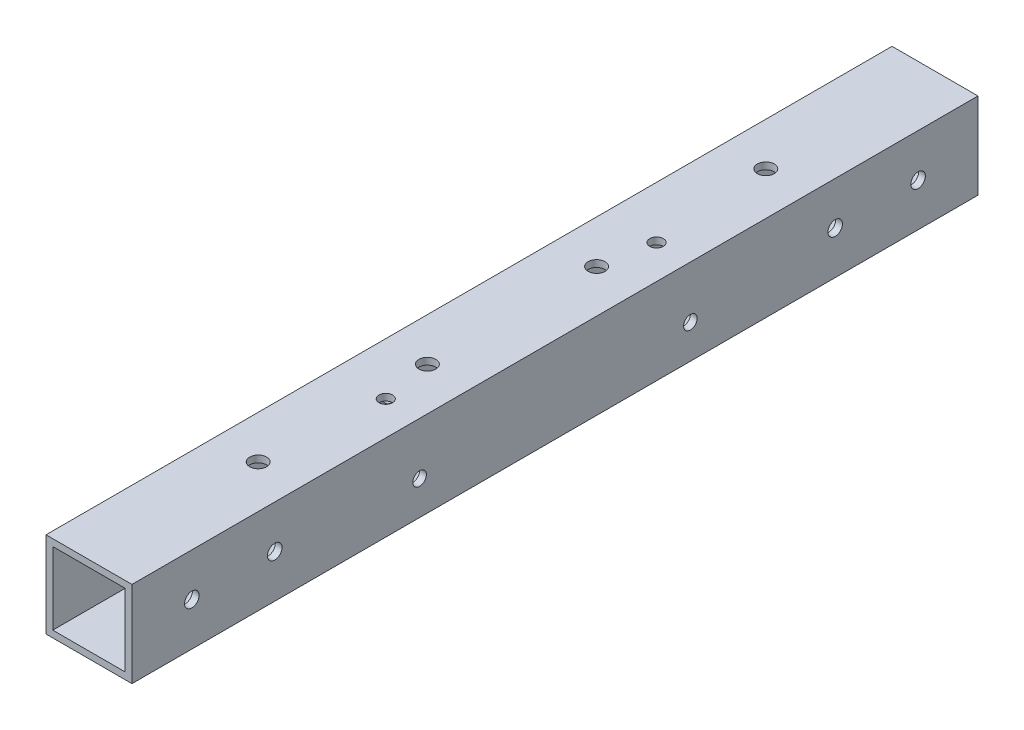
ISO-10303-21;
HEADER;
FILE_DESCRIPTION(('STEP AP214'),'2;1');
FILE_NAME('part.step','',(''),(''),'','','');
FILE_SCHEMA(('AUTOMOTIVE_DESIGN { 1 0 10303 214 1 1 1 1 }'));
ENDSEC;
DATA;
#1=APPLICATION_CONTEXT('core data for automotive mechanical design processes');
#2=APPLICATION_PROTOCOL_DEFINITION('international standard','automotive_design',2000,#1);
#3=PRODUCT_CONTEXT('',#1,'mechanical');
#4=PRODUCT('Part','Part','',(#3));
#5=PRODUCT_RELATED_PRODUCT_CATEGORY('part','',(#4));
#6=PRODUCT_DEFINITION_FORMATION('','',#4);
#7=PRODUCT_DEFINITION_CONTEXT('part definition',#1,'design');
#8=PRODUCT_DEFINITION('design','',#6,#7);
#9=PRODUCT_DEFINITION_SHAPE('','',#8);
#10=(LENGTH_UNIT() NAMED_UNIT(*) SI_UNIT(.MILLI.,.METRE.));
#11=(NAMED_UNIT(*) PLANE_ANGLE_UNIT() SI_UNIT($,.RADIAN.));
#12=(NAMED_UNIT(*) SI_UNIT($,.STERADIAN.) SOLID_ANGLE_UNIT());
#13=UNCERTAINTY_MEASURE_WITH_UNIT(LENGTH_MEASURE(1.E-05),#10,'distance_accuracy_value','');
#14=(GEOMETRIC_REPRESENTATION_CONTEXT(3) GLOBAL_UNCERTAINTY_ASSIGNED_CONTEXT((#13)) GLOBAL_UNIT_ASSIGNED_CONTEXT((#10,
#11,#12)) REPRESENTATION_CONTEXT('',''));
#15=CARTESIAN_POINT('',(0.,0.,0.));
#16=DIRECTION('',(0.,0.,1.));
#17=DIRECTION('',(1.,0.,0.));
#18=AXIS2_PLACEMENT_3D('',#15,#16,#17);
#19=CARTESIAN_POINT('',(0.,0.,250.));
#20=DIRECTION('',(0.,0.,1.));
#21=DIRECTION('',(1.,0.,0.));
#22=AXIS2_PLACEMENT_3D('',#19,#20,#21);
#23=PLANE('',#22);
#24=DIRECTION('',(0.,-1.,0.));
#25=VECTOR('',#24,1.);
#26=CARTESIAN_POINT('',(-12.7,12.7,250.));
#27=LINE('',#26,#25);
#28=CARTESIAN_POINT('',(-12.7,12.7,250.));
#29=VERTEX_POINT('',#28);
#30=CARTESIAN_POINT('',(-12.7,-12.7,250.));
#31=VERTEX_POINT('',#30);
#32=EDGE_CURVE('E137',#29,#31,#27,.T.);
#33=ORIENTED_EDGE('',*,*,#32,.T.);
#34=DIRECTION('',(1.,0.,0.));
#35=VECTOR('',#34,1.);
#36=CARTESIAN_POINT('',(-12.7,-12.7,250.));
#37=LINE('',#36,#35);
#38=CARTESIAN_POINT('',(12.7,-12.7,250.));
#39=VERTEX_POINT('',#38);
#40=EDGE_CURVE('E140',#31,#39,#37,.T.);
#41=ORIENTED_EDGE('',*,*,#40,.T.);
#42=DIRECTION('',(0.,-1.,0.));
#43=VECTOR('',#42,1.);
#44=CARTESIAN_POINT('',(12.7,12.7,250.));
#45=LINE('',#44,#43);
#46=CARTESIAN_POINT('',(12.7,12.7,250.));
#47=VERTEX_POINT('',#46);
#48=EDGE_CURVE('E143',#47,#39,#45,.T.);
#49=ORIENTED_EDGE('',*,*,#48,.F.);
#50=DIRECTION('',(1.,0.,0.));
#51=VECTOR('',#50,1.);
#52=CARTESIAN_POINT('',(-12.7,12.7,250.));
#53=LINE('',#52,#51);
#54=EDGE_CURVE('E146',#29,#47,#53,.T.);
#55=ORIENTED_EDGE('',*,*,#54,.F.);
#56=EDGE_LOOP('',(#33,#41,#49,#55));
#57=FACE_BOUND('',#56,.T.);
#58=DIRECTION('',(1.,0.,0.));
#59=VECTOR('',#58,1.);
#60=CARTESIAN_POINT('',(-10.7,-10.7,250.));
#61=LINE('',#60,#59);
#62=CARTESIAN_POINT('',(-10.7,-10.7,250.));
#63=VERTEX_POINT('',#62);
#64=CARTESIAN_POINT('',(10.7,-10.7,250.));
#65=VERTEX_POINT('',#64);
#66=EDGE_CURVE('E109',#63,#65,#61,.T.);
#67=ORIENTED_EDGE('',*,*,#66,.F.);
#68=DIRECTION('',(0.,-1.,0.));
#69=VECTOR('',#68,1.);
#70=CARTESIAN_POINT('',(-10.7,10.7,250.));
#71=LINE('',#70,#69);
#72=CARTESIAN_POINT('',(-10.7,10.7,250.));
#73=VERTEX_POINT('',#72);
#74=EDGE_CURVE('E100',#73,#63,#71,.T.);
#75=ORIENTED_EDGE('',*,*,#74,.F.);
#76=DIRECTION('',(1.,0.,0.));
#77=VECTOR('',#76,1.);
#78=CARTESIAN_POINT('',(-10.7,10.7,250.));
#79=LINE('',#78,#77);
#80=CARTESIAN_POINT('',(10.7,10.7,250.));
#81=VERTEX_POINT('',#80);
#82=EDGE_CURVE('E120',#73,#81,#79,.T.);
#83=ORIENTED_EDGE('',*,*,#82,.T.);
#84=DIRECTION('',(0.,-1.,0.));
#85=VECTOR('',#84,1.);
#86=CARTESIAN_POINT('',(10.7,10.7,250.));
#87=LINE('',#86,#85);
#88=EDGE_CURVE('E50',#81,#65,#87,.T.);
#89=ORIENTED_EDGE('',*,*,#88,.T.);
#90=EDGE_LOOP('',(#67,#75,#83,#89));
#91=FACE_BOUND('',#90,.T.);
#92=ADVANCED_FACE('F33',(#57,#91),#23,.T.);
#93=CARTESIAN_POINT('',(0.,0.,0.));
#94=DIRECTION('',(0.,0.,1.));
#95=DIRECTION('',(1.,0.,0.));
#96=AXIS2_PLACEMENT_3D('',#93,#94,#95);
#97=PLANE('',#96);
#98=DIRECTION('',(0.,-1.,0.));
#99=VECTOR('',#98,1.);
#100=CARTESIAN_POINT('',(-12.7,12.7,0.));
#101=LINE('',#100,#99);
#102=CARTESIAN_POINT('',(-12.7,12.7,0.));
#103=VERTEX_POINT('',#102);
#104=CARTESIAN_POINT('',(-12.7,-12.7,0.));
#105=VERTEX_POINT('',#104);
#106=EDGE_CURVE('E116',#103,#105,#101,.T.);
#107=ORIENTED_EDGE('',*,*,#106,.F.);
#108=DIRECTION('',(1.,0.,0.));
#109=VECTOR('',#108,1.);
#110=CARTESIAN_POINT('',(-12.7,12.7,0.));
#111=LINE('',#110,#109);
#112=CARTESIAN_POINT('',(12.7,12.7,0.));
#113=VERTEX_POINT('',#112);
#114=EDGE_CURVE('E141',#103,#113,#111,.T.);
#115=ORIENTED_EDGE('',*,*,#114,.T.);
#116=DIRECTION('',(0.,-1.,0.));
#117=VECTOR('',#116,1.);
#118=CARTESIAN_POINT('',(12.7,12.7,0.));
#119=LINE('',#118,#117);
#120=CARTESIAN_POINT('',(12.7,-12.7,0.));
#121=VERTEX_POINT('',#120);
#122=EDGE_CURVE('E155',#113,#121,#119,.T.);
#123=ORIENTED_EDGE('',*,*,#122,.T.);
#124=DIRECTION('',(1.,0.,0.));
#125=VECTOR('',#124,1.);
#126=CARTESIAN_POINT('',(-12.7,-12.7,0.));
#127=LINE('',#126,#125);
#128=EDGE_CURVE('E152',#105,#121,#127,.T.);
#129=ORIENTED_EDGE('',*,*,#128,.F.);
#130=EDGE_LOOP('',(#107,#115,#123,#129));
#131=FACE_BOUND('',#130,.T.);
#132=DIRECTION('',(0.,-1.,0.));
#133=VECTOR('',#132,1.);
#134=CARTESIAN_POINT('',(-10.7,10.7,0.));
#135=LINE('',#134,#133);
#136=CARTESIAN_POINT('',(-10.7,10.7,0.));
#137=VERTEX_POINT('',#136);
#138=CARTESIAN_POINT('',(-10.7,-10.7,0.));
#139=VERTEX_POINT('',#138);
#140=EDGE_CURVE('E58',#137,#139,#135,.T.);
#141=ORIENTED_EDGE('',*,*,#140,.T.);
#142=DIRECTION('',(1.,0.,0.));
#143=VECTOR('',#142,1.);
#144=CARTESIAN_POINT('',(-10.7,-10.7,0.));
#145=LINE('',#144,#143);
#146=CARTESIAN_POINT('',(10.7,-10.7,0.));
#147=VERTEX_POINT('',#146);
#148=EDGE_CURVE('E115',#139,#147,#145,.T.);
#149=ORIENTED_EDGE('',*,*,#148,.T.);
#150=DIRECTION('',(0.,-1.,0.));
#151=VECTOR('',#150,1.);
#152=CARTESIAN_POINT('',(10.7,10.7,0.));
#153=LINE('',#152,#151);
#154=CARTESIAN_POINT('',(10.7,10.7,0.));
#155=VERTEX_POINT('',#154);
#156=EDGE_CURVE('E128',#155,#147,#153,.T.);
#157=ORIENTED_EDGE('',*,*,#156,.F.);
#158=DIRECTION('',(1.,0.,0.));
#159=VECTOR('',#158,1.);
#160=CARTESIAN_POINT('',(-10.7,10.7,0.));
#161=LINE('',#160,#159);
#162=EDGE_CURVE('E110',#137,#155,#161,.T.);
#163=ORIENTED_EDGE('',*,*,#162,.F.);
#164=EDGE_LOOP('',(#141,#149,#157,#163));
#165=FACE_BOUND('',#164,.T.);
#166=ADVANCED_FACE('F323',(#131,#165),#97,.F.);
#167=CARTESIAN_POINT('',(-12.7,12.7,250.));
#168=DIRECTION('',(1.,0.,0.));
#169=DIRECTION('',(0.,1.,0.));
#170=AXIS2_PLACEMENT_3D('',#167,#168,#169);
#171=PLANE('',#170);
#172=CARTESIAN_POINT('',(-12.7,-2.69999999999985,84.9999999999999));
#173=DIRECTION('',(1.,0.,0.));
#174=DIRECTION('',(0.,1.,0.));
#175=AXIS2_PLACEMENT_3D('',#172,#173,#174);
#176=CIRCLE('',#175,2.);
#177=CARTESIAN_POINT('',(-12.7,-0.699999999999858,84.9999999999999));
#178=VERTEX_POINT('',#177);
#179=EDGE_CURVE('E233',#178,#178,#176,.T.);
#180=ORIENTED_EDGE('',*,*,#179,.T.);
#181=EDGE_LOOP('',(#180));
#182=FACE_BOUND('',#181,.T.);
#183=CARTESIAN_POINT('',(-12.7,-2.69999999999985,165.));
#184=DIRECTION('',(1.,0.,0.));
#185=DIRECTION('',(0.,1.,0.));
#186=AXIS2_PLACEMENT_3D('',#183,#184,#185);
#187=CIRCLE('',#186,2.00000000000002);
#188=CARTESIAN_POINT('',(-12.7,-0.69999999999983,165.));
#189=VERTEX_POINT('',#188);
#190=EDGE_CURVE('E244',#189,#189,#187,.T.);
#191=ORIENTED_EDGE('',*,*,#190,.T.);
#192=EDGE_LOOP('',(#191));
#193=FACE_BOUND('',#192,.T.);
#194=CARTESIAN_POINT('',(-12.7,0.,50.));
#195=DIRECTION('',(-1.,0.,0.));
#196=DIRECTION('',(0.,-1.,0.));
#197=AXIS2_PLACEMENT_3D('',#194,#195,#196);
#198=CIRCLE('',#197,2.5);
#199=CARTESIAN_POINT('',(-12.7,-2.5,50.));
#200=VERTEX_POINT('',#199);
#201=EDGE_CURVE('E221',#200,#200,#198,.T.);
#202=ORIENTED_EDGE('',*,*,#201,.F.);
#203=EDGE_LOOP('',(#202));
#204=FACE_BOUND('',#203,.T.);
#205=CARTESIAN_POINT('',(-12.7,0.,200.));
#206=DIRECTION('',(-1.,0.,0.));
#207=DIRECTION('',(0.,-1.,0.));
#208=AXIS2_PLACEMENT_3D('',#205,#206,#207);
#209=CIRCLE('',#208,2.5);
#210=CARTESIAN_POINT('',(-12.7,-2.5,200.));
#211=VERTEX_POINT('',#210);
#212=EDGE_CURVE('E284',#211,#211,#209,.T.);
#213=ORIENTED_EDGE('',*,*,#212,.F.);
#214=EDGE_LOOP('',(#213));
#215=FACE_BOUND('',#214,.T.);
#216=CARTESIAN_POINT('',(-12.7,0.,150.));
#217=DIRECTION('',(-1.,0.,0.));
#218=DIRECTION('',(0.,-1.,0.));
#219=AXIS2_PLACEMENT_3D('',#216,#217,#218);
#220=CIRCLE('',#219,2.5);
#221=CARTESIAN_POINT('',(-12.7,-2.5,150.));
#222=VERTEX_POINT('',#221);
#223=EDGE_CURVE('E281',#222,#222,#220,.T.);
#224=ORIENTED_EDGE('',*,*,#223,.F.);
#225=EDGE_LOOP('',(#224));
#226=FACE_BOUND('',#225,.T.);
#227=CARTESIAN_POINT('',(-12.7,0.,100.));
#228=DIRECTION('',(-1.,0.,0.));
#229=DIRECTION('',(0.,-1.,0.));
#230=AXIS2_PLACEMENT_3D('',#227,#228,#229);
#231=CIRCLE('',#230,2.5);
#232=CARTESIAN_POINT('',(-12.7,-2.5,100.));
#233=VERTEX_POINT('',#232);
#234=EDGE_CURVE('E198',#233,#233,#231,.T.);
#235=ORIENTED_EDGE('',*,*,#234,.F.);
#236=EDGE_LOOP('',(#235));
#237=FACE_BOUND('',#236,.T.);
#238=ORIENTED_EDGE('',*,*,#106,.T.);
#239=DIRECTION('',(0.,0.,-1.));
#240=VECTOR('',#239,1.);
#241=CARTESIAN_POINT('',(-12.7,-12.7,250.));
#242=LINE('',#241,#240);
#243=EDGE_CURVE('E11',#31,#105,#242,.T.);
#244=ORIENTED_EDGE('',*,*,#243,.F.);
#245=ORIENTED_EDGE('',*,*,#32,.F.);
#246=DIRECTION('',(0.,0.,-1.));
#247=VECTOR('',#246,1.);
#248=CARTESIAN_POINT('',(-12.7,12.7,250.));
#249=LINE('',#248,#247);
#250=EDGE_CURVE('E149',#29,#103,#249,.T.);
#251=ORIENTED_EDGE('',*,*,#250,.T.);
#252=EDGE_LOOP('',(#238,#244,#245,#251));
#253=FACE_BOUND('',#252,.T.);
#254=ADVANCED_FACE('F35',(#182,#193,#204,#215,#226,#237,#253),#171,.F.);
#255=CARTESIAN_POINT('',(-12.7,-12.7,250.));
#256=DIRECTION('',(0.,1.,0.));
#257=DIRECTION('',(0.,0.,1.));
#258=AXIS2_PLACEMENT_3D('',#255,#256,#257);
#259=PLANE('',#258);
#260=CARTESIAN_POINT('',(2.70000000000002,-12.7,165.));
#261=DIRECTION('',(0.,-1.,0.));
#262=DIRECTION('',(0.,0.,-1.));
#263=AXIS2_PLACEMENT_3D('',#260,#261,#262);
#264=CIRCLE('',#263,2.);
#265=CARTESIAN_POINT('',(2.70000000000002,-12.7,163.));
#266=VERTEX_POINT('',#265);
#267=EDGE_CURVE('E258',#266,#266,#264,.T.);
#268=ORIENTED_EDGE('',*,*,#267,.F.);
#269=EDGE_LOOP('',(#268));
#270=FACE_BOUND('',#269,.T.);
#271=CARTESIAN_POINT('',(2.70000000000002,-12.7,85.0000000000001));
#272=DIRECTION('',(0.,-1.,0.));
#273=DIRECTION('',(0.,0.,-1.));
#274=AXIS2_PLACEMENT_3D('',#271,#272,#273);
#275=CIRCLE('',#274,2.00000000000001);
#276=CARTESIAN_POINT('',(2.70000000000002,-12.7,83.0000000000001));
#277=VERTEX_POINT('',#276);
#278=EDGE_CURVE('E255',#277,#277,#275,.T.);
#279=ORIENTED_EDGE('',*,*,#278,.F.);
#280=EDGE_LOOP('',(#279));
#281=FACE_BOUND('',#280,.T.);
#282=CARTESIAN_POINT('',(0.,-12.7,42.1999999862548));
#283=DIRECTION('',(0.,-1.,0.));
#284=DIRECTION('',(0.,0.,-1.));
#285=AXIS2_PLACEMENT_3D('',#282,#283,#284);
#286=CIRCLE('',#285,2.1500000040323);
#287=CARTESIAN_POINT('',(0.,-12.7,40.0499999822225));
#288=VERTEX_POINT('',#287);
#289=EDGE_CURVE('E190',#288,#288,#286,.T.);
#290=ORIENTED_EDGE('',*,*,#289,.F.);
#291=EDGE_LOOP('',(#290));
#292=FACE_BOUND('',#291,.T.);
#293=CARTESIAN_POINT('',(0.,-12.7,17.6999999862548));
#294=DIRECTION('',(0.,-1.,0.));
#295=DIRECTION('',(0.,0.,-1.));
#296=AXIS2_PLACEMENT_3D('',#293,#294,#295);
#297=CIRCLE('',#296,2.1500000040323);
#298=CARTESIAN_POINT('',(0.,-12.7,15.5499999822225));
#299=VERTEX_POINT('',#298);
#300=EDGE_CURVE('E207',#299,#299,#297,.T.);
#301=ORIENTED_EDGE('',*,*,#300,.F.);
#302=EDGE_LOOP('',(#301));
#303=FACE_BOUND('',#302,.T.);
#304=CARTESIAN_POINT('',(0.,-12.7,232.3));
#305=DIRECTION('',(0.,-1.,0.));
#306=DIRECTION('',(0.,0.,-1.));
#307=AXIS2_PLACEMENT_3D('',#304,#305,#306);
#308=CIRCLE('',#307,2.14999999994746);
#309=CARTESIAN_POINT('',(0.,-12.7,230.150000000053));
#310=VERTEX_POINT('',#309);
#311=EDGE_CURVE('E174',#310,#310,#308,.T.);
#312=ORIENTED_EDGE('',*,*,#311,.F.);
#313=EDGE_LOOP('',(#312));
#314=FACE_BOUND('',#313,.T.);
#315=CARTESIAN_POINT('',(0.,-12.7,207.8));
#316=DIRECTION('',(0.,-1.,0.));
#317=DIRECTION('',(0.,0.,-1.));
#318=AXIS2_PLACEMENT_3D('',#315,#316,#317);
#319=CIRCLE('',#318,2.14999999994746);
#320=CARTESIAN_POINT('',(0.,-12.7,205.650000000052));
#321=VERTEX_POINT('',#320);
#322=EDGE_CURVE('E185',#321,#321,#319,.T.);
#323=ORIENTED_EDGE('',*,*,#322,.F.);
#324=EDGE_LOOP('',(#323));
#325=FACE_BOUND('',#324,.T.);
#326=ORIENTED_EDGE('',*,*,#128,.T.);
#327=DIRECTION('',(0.,0.,-1.));
#328=VECTOR('',#327,1.);
#329=CARTESIAN_POINT('',(12.7,-12.7,250.));
#330=LINE('',#329,#328);
#331=EDGE_CURVE('E42',#39,#121,#330,.T.);
#332=ORIENTED_EDGE('',*,*,#331,.F.);
#333=ORIENTED_EDGE('',*,*,#40,.F.);
#334=ORIENTED_EDGE('',*,*,#243,.T.);
#335=EDGE_LOOP('',(#326,#332,#333,#334));
#336=FACE_BOUND('',#335,.T.);
#337=ADVANCED_FACE('F314',(#270,#281,#292,#303,#314,#325,#336),#259,.F.);
#338=CARTESIAN_POINT('',(12.7,12.7,250.));
#339=DIRECTION('',(1.,0.,0.));
#340=DIRECTION('',(0.,1.,0.));
#341=AXIS2_PLACEMENT_3D('',#338,#339,#340);
#342=PLANE('',#341);
#343=CARTESIAN_POINT('',(12.7,-2.69999999999985,84.9999999999999));
#344=DIRECTION('',(1.,0.,0.));
#345=DIRECTION('',(0.,1.,0.));
#346=AXIS2_PLACEMENT_3D('',#343,#344,#345);
#347=CIRCLE('',#346,2.);
#348=CARTESIAN_POINT('',(12.7,-0.699999999999854,84.9999999999999));
#349=VERTEX_POINT('',#348);
#350=EDGE_CURVE('E239',#349,#349,#347,.T.);
#351=ORIENTED_EDGE('',*,*,#350,.F.);
#352=EDGE_LOOP('',(#351));
#353=FACE_BOUND('',#352,.T.);
#354=CARTESIAN_POINT('',(12.7,-2.69999999999985,165.));
#355=DIRECTION('',(1.,0.,0.));
#356=DIRECTION('',(0.,1.,0.));
#357=AXIS2_PLACEMENT_3D('',#354,#355,#356);
#358=CIRCLE('',#357,2.00000000000002);
#359=CARTESIAN_POINT('',(12.7,-0.699999999999827,165.));
#360=VERTEX_POINT('',#359);
#361=EDGE_CURVE('E249',#360,#360,#358,.T.);
#362=ORIENTED_EDGE('',*,*,#361,.F.);
#363=EDGE_LOOP('',(#362));
#364=FACE_BOUND('',#363,.T.);
#365=CARTESIAN_POINT('',(12.7,-9.80214607398944E-09,42.1999999853121));
#366=DIRECTION('',(1.,0.,0.));
#367=DIRECTION('',(0.,1.,0.));
#368=AXIS2_PLACEMENT_3D('',#365,#366,#367);
#369=CIRCLE('',#368,2.15);
#370=CARTESIAN_POINT('',(12.7,2.14999999019786,42.1999999853121));
#371=VERTEX_POINT('',#370);
#372=EDGE_CURVE('E182',#371,#371,#369,.T.);
#373=ORIENTED_EDGE('',*,*,#372,.F.);
#374=EDGE_LOOP('',(#373));
#375=FACE_BOUND('',#374,.T.);
#376=CARTESIAN_POINT('',(12.7,-9.82510210342791E-09,17.6999999853121));
#377=DIRECTION('',(1.,0.,0.));
#378=DIRECTION('',(0.,1.,0.));
#379=AXIS2_PLACEMENT_3D('',#376,#377,#378);
#380=CIRCLE('',#379,2.14999999956341);
#381=CARTESIAN_POINT('',(12.7,2.14999998973831,17.6999999853121));
#382=VERTEX_POINT('',#381);
#383=EDGE_CURVE('E193',#382,#382,#380,.T.);
#384=ORIENTED_EDGE('',*,*,#383,.F.);
#385=EDGE_LOOP('',(#384));
#386=FACE_BOUND('',#385,.T.);
#387=CARTESIAN_POINT('',(12.7,0.,232.3));
#388=DIRECTION('',(1.,0.,0.));
#389=DIRECTION('',(0.,1.,0.));
#390=AXIS2_PLACEMENT_3D('',#387,#388,#389);
#391=CIRCLE('',#390,2.15000000000002);
#392=CARTESIAN_POINT('',(12.7,2.15000000000001,232.3));
#393=VERTEX_POINT('',#392);
#394=EDGE_CURVE('E167',#393,#393,#391,.T.);
#395=ORIENTED_EDGE('',*,*,#394,.F.);
#396=EDGE_LOOP('',(#395));
#397=FACE_BOUND('',#396,.T.);
#398=CARTESIAN_POINT('',(12.7,0.,207.8));
#399=DIRECTION('',(1.,0.,0.));
#400=DIRECTION('',(0.,1.,0.));
#401=AXIS2_PLACEMENT_3D('',#398,#399,#400);
#402=CIRCLE('',#401,2.14999999999996);
#403=CARTESIAN_POINT('',(12.7,2.14999999999996,207.8));
#404=VERTEX_POINT('',#403);
#405=EDGE_CURVE('E177',#404,#404,#402,.T.);
#406=ORIENTED_EDGE('',*,*,#405,.F.);
#407=EDGE_LOOP('',(#406));
#408=FACE_BOUND('',#407,.T.);
#409=ORIENTED_EDGE('',*,*,#122,.F.);
#410=DIRECTION('',(0.,0.,-1.));
#411=VECTOR('',#410,1.);
#412=CARTESIAN_POINT('',(12.7,12.7,250.));
#413=LINE('',#412,#411);
#414=EDGE_CURVE('E161',#47,#113,#413,.T.);
#415=ORIENTED_EDGE('',*,*,#414,.F.);
#416=ORIENTED_EDGE('',*,*,#48,.T.);
#417=ORIENTED_EDGE('',*,*,#331,.T.);
#418=EDGE_LOOP('',(#409,#415,#416,#417));
#419=FACE_BOUND('',#418,.T.);
#420=ADVANCED_FACE('F310',(#353,#364,#375,#386,#397,#408,#419),#342,.T.);
#421=CARTESIAN_POINT('',(-12.7,12.7,250.));
#422=DIRECTION('',(0.,1.,0.));
#423=DIRECTION('',(0.,0.,1.));
#424=AXIS2_PLACEMENT_3D('',#421,#422,#423);
#425=PLANE('',#424);
#426=CARTESIAN_POINT('',(2.70000000000002,12.7,165.));
#427=DIRECTION('',(0.,-1.,0.));
#428=DIRECTION('',(0.,0.,-1.));
#429=AXIS2_PLACEMENT_3D('',#426,#427,#428);
#430=CIRCLE('',#429,2.);
#431=CARTESIAN_POINT('',(2.70000000000002,12.7,163.));
#432=VERTEX_POINT('',#431);
#433=EDGE_CURVE('E226',#432,#432,#430,.T.);
#434=ORIENTED_EDGE('',*,*,#433,.T.);
#435=EDGE_LOOP('',(#434));
#436=FACE_BOUND('',#435,.T.);
#437=CARTESIAN_POINT('',(2.70000000000002,12.7,85.0000000000001));
#438=DIRECTION('',(0.,-1.,0.));
#439=DIRECTION('',(0.,0.,-1.));
#440=AXIS2_PLACEMENT_3D('',#437,#438,#439);
#441=CIRCLE('',#440,2.00000000000001);
#442=CARTESIAN_POINT('',(2.70000000000002,12.7,83.0000000000001));
#443=VERTEX_POINT('',#442);
#444=EDGE_CURVE('E261',#443,#443,#441,.T.);
#445=ORIENTED_EDGE('',*,*,#444,.T.);
#446=EDGE_LOOP('',(#445));
#447=FACE_BOUND('',#446,.T.);
#448=CARTESIAN_POINT('',(0.,12.7,50.));
#449=DIRECTION('',(0.,1.,0.));
#450=DIRECTION('',(0.,0.,1.));
#451=AXIS2_PLACEMENT_3D('',#448,#449,#450);
#452=CIRCLE('',#451,2.5);
#453=CARTESIAN_POINT('',(0.,12.7,52.5));
#454=VERTEX_POINT('',#453);
#455=EDGE_CURVE('E212',#454,#454,#452,.T.);
#456=ORIENTED_EDGE('',*,*,#455,.F.);
#457=EDGE_LOOP('',(#456));
#458=FACE_BOUND('',#457,.T.);
#459=CARTESIAN_POINT('',(0.,12.7,100.));
#460=DIRECTION('',(0.,1.,0.));
#461=DIRECTION('',(0.,0.,1.));
#462=AXIS2_PLACEMENT_3D('',#459,#460,#461);
#463=CIRCLE('',#462,2.5);
#464=CARTESIAN_POINT('',(0.,12.7,102.5));
#465=VERTEX_POINT('',#464);
#466=EDGE_CURVE('E273',#465,#465,#463,.T.);
#467=ORIENTED_EDGE('',*,*,#466,.F.);
#468=EDGE_LOOP('',(#467));
#469=FACE_BOUND('',#468,.T.);
#470=CARTESIAN_POINT('',(0.,12.7,150.));
#471=DIRECTION('',(0.,1.,0.));
#472=DIRECTION('',(0.,0.,1.));
#473=AXIS2_PLACEMENT_3D('',#470,#471,#472);
#474=CIRCLE('',#473,2.5);
#475=CARTESIAN_POINT('',(0.,12.7,152.5));
#476=VERTEX_POINT('',#475);
#477=EDGE_CURVE('E276',#476,#476,#474,.T.);
#478=ORIENTED_EDGE('',*,*,#477,.F.);
#479=EDGE_LOOP('',(#478));
#480=FACE_BOUND('',#479,.T.);
#481=CARTESIAN_POINT('',(0.,12.7,200.));
#482=DIRECTION('',(0.,1.,0.));
#483=DIRECTION('',(0.,0.,1.));
#484=AXIS2_PLACEMENT_3D('',#481,#482,#483);
#485=CIRCLE('',#484,2.5);
#486=CARTESIAN_POINT('',(0.,12.7,202.5));
#487=VERTEX_POINT('',#486);
#488=EDGE_CURVE('E270',#487,#487,#485,.T.);
#489=ORIENTED_EDGE('',*,*,#488,.F.);
#490=EDGE_LOOP('',(#489));
#491=FACE_BOUND('',#490,.T.);
#492=ORIENTED_EDGE('',*,*,#114,.F.);
#493=ORIENTED_EDGE('',*,*,#250,.F.);
#494=ORIENTED_EDGE('',*,*,#54,.T.);
#495=ORIENTED_EDGE('',*,*,#414,.T.);
#496=EDGE_LOOP('',(#492,#493,#494,#495));
#497=FACE_BOUND('',#496,.T.);
#498=ADVANCED_FACE('F313',(#436,#447,#458,#469,#480,#491,#497),#425,.T.);
#499=CARTESIAN_POINT('',(-10.7,10.7,250.));
#500=DIRECTION('',(1.,0.,0.));
#501=DIRECTION('',(0.,0.,-1.));
#502=AXIS2_PLACEMENT_3D('',#499,#500,#501);
#503=PLANE('',#502);
#504=CARTESIAN_POINT('',(-10.7,-2.69999999999985,84.9999999999999));
#505=DIRECTION('',(1.,0.,0.));
#506=DIRECTION('',(0.,0.,-1.));
#507=AXIS2_PLACEMENT_3D('',#504,#505,#506);
#508=CIRCLE('',#507,2.);
#509=CARTESIAN_POINT('',(-10.7,-2.69999999999985,82.9999999999999));
#510=VERTEX_POINT('',#509);
#511=EDGE_CURVE('E252',#510,#510,#508,.T.);
#512=ORIENTED_EDGE('',*,*,#511,.F.);
#513=EDGE_LOOP('',(#512));
#514=FACE_BOUND('',#513,.T.);
#515=CARTESIAN_POINT('',(-10.7,-2.69999999999985,165.));
#516=DIRECTION('',(1.,0.,0.));
#517=DIRECTION('',(0.,0.,-1.));
#518=AXIS2_PLACEMENT_3D('',#515,#516,#517);
#519=CIRCLE('',#518,2.00000000000002);
#520=CARTESIAN_POINT('',(-10.7,-2.69999999999985,163.));
#521=VERTEX_POINT('',#520);
#522=EDGE_CURVE('E232',#521,#521,#519,.T.);
#523=ORIENTED_EDGE('',*,*,#522,.F.);
#524=EDGE_LOOP('',(#523));
#525=FACE_BOUND('',#524,.T.);
#526=CARTESIAN_POINT('',(-10.7,0.,50.));
#527=DIRECTION('',(1.,0.,0.));
#528=DIRECTION('',(0.,0.,-1.));
#529=AXIS2_PLACEMENT_3D('',#526,#527,#528);
#530=CIRCLE('',#529,2.5);
#531=CARTESIAN_POINT('',(-10.7,0.,47.5));
#532=VERTEX_POINT('',#531);
#533=EDGE_CURVE('E204',#532,#532,#530,.T.);
#534=ORIENTED_EDGE('',*,*,#533,.F.);
#535=EDGE_LOOP('',(#534));
#536=FACE_BOUND('',#535,.T.);
#537=CARTESIAN_POINT('',(-10.7,0.,200.));
#538=DIRECTION('',(1.,0.,0.));
#539=DIRECTION('',(0.,0.,-1.));
#540=AXIS2_PLACEMENT_3D('',#537,#538,#539);
#541=CIRCLE('',#540,2.5);
#542=CARTESIAN_POINT('',(-10.7,0.,197.5));
#543=VERTEX_POINT('',#542);
#544=EDGE_CURVE('E201',#543,#543,#541,.T.);
#545=ORIENTED_EDGE('',*,*,#544,.F.);
#546=EDGE_LOOP('',(#545));
#547=FACE_BOUND('',#546,.T.);
#548=CARTESIAN_POINT('',(-10.7,0.,150.));
#549=DIRECTION('',(1.,0.,0.));
#550=DIRECTION('',(0.,0.,-1.));
#551=AXIS2_PLACEMENT_3D('',#548,#549,#550);
#552=CIRCLE('',#551,2.5);
#553=CARTESIAN_POINT('',(-10.7,0.,147.5));
#554=VERTEX_POINT('',#553);
#555=EDGE_CURVE('E197',#554,#554,#552,.T.);
#556=ORIENTED_EDGE('',*,*,#555,.F.);
#557=EDGE_LOOP('',(#556));
#558=FACE_BOUND('',#557,.T.);
#559=CARTESIAN_POINT('',(-10.7,0.,100.));
#560=DIRECTION('',(1.,0.,0.));
#561=DIRECTION('',(0.,0.,-1.));
#562=AXIS2_PLACEMENT_3D('',#559,#560,#561);
#563=CIRCLE('',#562,2.5);
#564=CARTESIAN_POINT('',(-10.7,0.,97.5));
#565=VERTEX_POINT('',#564);
#566=EDGE_CURVE('E194',#565,#565,#563,.T.);
#567=ORIENTED_EDGE('',*,*,#566,.F.);
#568=EDGE_LOOP('',(#567));
#569=FACE_BOUND('',#568,.T.);
#570=ORIENTED_EDGE('',*,*,#140,.F.);
#571=DIRECTION('',(0.,0.,-1.));
#572=VECTOR('',#571,1.);
#573=CARTESIAN_POINT('',(-10.7,10.7,250.));
#574=LINE('',#573,#572);
#575=EDGE_CURVE('E104',#73,#137,#574,.T.);
#576=ORIENTED_EDGE('',*,*,#575,.F.);
#577=ORIENTED_EDGE('',*,*,#74,.T.);
#578=DIRECTION('',(0.,0.,-1.));
#579=VECTOR('',#578,1.);
#580=CARTESIAN_POINT('',(-10.7,-10.7,250.));
#581=LINE('',#580,#579);
#582=EDGE_CURVE('E103',#63,#139,#581,.T.);
#583=ORIENTED_EDGE('',*,*,#582,.T.);
#584=EDGE_LOOP('',(#570,#576,#577,#583));
#585=FACE_BOUND('',#584,.T.);
#586=ADVANCED_FACE('F102',(#514,#525,#536,#547,#558,#569,#585),#503,.T.);
#587=CARTESIAN_POINT('',(-10.7,-10.7,250.));
#588=DIRECTION('',(0.,1.,0.));
#589=DIRECTION('',(-1.,0.,0.));
#590=AXIS2_PLACEMENT_3D('',#587,#588,#589);
#591=PLANE('',#590);
#592=CARTESIAN_POINT('',(2.70000000000002,-10.7,165.));
#593=DIRECTION('',(0.,1.,0.));
#594=DIRECTION('',(-1.,0.,0.));
#595=AXIS2_PLACEMENT_3D('',#592,#593,#594);
#596=CIRCLE('',#595,2.);
#597=CARTESIAN_POINT('',(0.70000000000002,-10.7,165.));
#598=VERTEX_POINT('',#597);
#599=EDGE_CURVE('E229',#598,#598,#596,.T.);
#600=ORIENTED_EDGE('',*,*,#599,.F.);
#601=EDGE_LOOP('',(#600));
#602=FACE_BOUND('',#601,.T.);
#603=CARTESIAN_POINT('',(2.70000000000002,-10.7,85.0000000000001));
#604=DIRECTION('',(0.,1.,0.));
#605=DIRECTION('',(-1.,0.,0.));
#606=AXIS2_PLACEMENT_3D('',#603,#604,#605);
#607=CIRCLE('',#606,2.00000000000001);
#608=CARTESIAN_POINT('',(0.700000000000015,-10.7,85.0000000000001));
#609=VERTEX_POINT('',#608);
#610=EDGE_CURVE('E225',#609,#609,#607,.T.);
#611=ORIENTED_EDGE('',*,*,#610,.F.);
#612=EDGE_LOOP('',(#611));
#613=FACE_BOUND('',#612,.T.);
#614=CARTESIAN_POINT('',(0.,-10.7,42.1999999862548));
#615=DIRECTION('',(0.,1.,0.));
#616=DIRECTION('',(-1.,0.,0.));
#617=AXIS2_PLACEMENT_3D('',#614,#615,#616);
#618=CIRCLE('',#617,2.1500000040323);
#619=CARTESIAN_POINT('',(-2.15000000403231,-10.7,42.1999999862548));
#620=VERTEX_POINT('',#619);
#621=EDGE_CURVE('E189',#620,#620,#618,.T.);
#622=ORIENTED_EDGE('',*,*,#621,.F.);
#623=EDGE_LOOP('',(#622));
#624=FACE_BOUND('',#623,.T.);
#625=CARTESIAN_POINT('',(0.,-10.7,17.6999999862548));
#626=DIRECTION('',(0.,1.,0.));
#627=DIRECTION('',(-1.,0.,0.));
#628=AXIS2_PLACEMENT_3D('',#625,#626,#627);
#629=CIRCLE('',#628,2.1500000040323);
#630=CARTESIAN_POINT('',(-2.1500000040323,-10.7,17.6999999862548));
#631=VERTEX_POINT('',#630);
#632=EDGE_CURVE('E186',#631,#631,#629,.T.);
#633=ORIENTED_EDGE('',*,*,#632,.F.);
#634=EDGE_LOOP('',(#633));
#635=FACE_BOUND('',#634,.T.);
#636=CARTESIAN_POINT('',(0.,-10.7,232.3));
#637=DIRECTION('',(0.,1.,0.));
#638=DIRECTION('',(-1.,0.,0.));
#639=AXIS2_PLACEMENT_3D('',#636,#637,#638);
#640=CIRCLE('',#639,2.14999999994746);
#641=CARTESIAN_POINT('',(-2.14999999994746,-10.7,232.3));
#642=VERTEX_POINT('',#641);
#643=EDGE_CURVE('E173',#642,#642,#640,.T.);
#644=ORIENTED_EDGE('',*,*,#643,.F.);
#645=EDGE_LOOP('',(#644));
#646=FACE_BOUND('',#645,.T.);
#647=CARTESIAN_POINT('',(0.,-10.7,207.8));
#648=DIRECTION('',(0.,1.,0.));
#649=DIRECTION('',(-1.,0.,0.));
#650=AXIS2_PLACEMENT_3D('',#647,#648,#649);
#651=CIRCLE('',#650,2.14999999994746);
#652=CARTESIAN_POINT('',(-2.14999999994745,-10.7,207.8));
#653=VERTEX_POINT('',#652);
#654=EDGE_CURVE('E170',#653,#653,#651,.T.);
#655=ORIENTED_EDGE('',*,*,#654,.F.);
#656=EDGE_LOOP('',(#655));
#657=FACE_BOUND('',#656,.T.);
#658=ORIENTED_EDGE('',*,*,#148,.F.);
#659=ORIENTED_EDGE('',*,*,#582,.F.);
#660=ORIENTED_EDGE('',*,*,#66,.T.);
#661=DIRECTION('',(0.,0.,-1.));
#662=VECTOR('',#661,1.);
#663=CARTESIAN_POINT('',(10.7,-10.7,250.));
#664=LINE('',#663,#662);
#665=EDGE_CURVE('E117',#65,#147,#664,.T.);
#666=ORIENTED_EDGE('',*,*,#665,.T.);
#667=EDGE_LOOP('',(#658,#659,#660,#666));
#668=FACE_BOUND('',#667,.T.);
#669=ADVANCED_FACE('F113',(#602,#613,#624,#635,#646,#657,#668),#591,.T.);
#670=CARTESIAN_POINT('',(10.7,10.7,250.));
#671=DIRECTION('',(1.,0.,0.));
#672=DIRECTION('',(0.,1.,0.));
#673=AXIS2_PLACEMENT_3D('',#670,#671,#672);
#674=PLANE('',#673);
#675=CARTESIAN_POINT('',(10.7,-2.69999999999985,84.9999999999999));
#676=DIRECTION('',(1.,0.,0.));
#677=DIRECTION('',(0.,1.,0.));
#678=AXIS2_PLACEMENT_3D('',#675,#676,#677);
#679=CIRCLE('',#678,2.);
#680=CARTESIAN_POINT('',(10.7,-0.699999999999855,84.9999999999999));
#681=VERTEX_POINT('',#680);
#682=EDGE_CURVE('E37',#681,#681,#679,.T.);
#683=ORIENTED_EDGE('',*,*,#682,.T.);
#684=EDGE_LOOP('',(#683));
#685=FACE_BOUND('',#684,.T.);
#686=CARTESIAN_POINT('',(10.7,-2.69999999999985,165.));
#687=DIRECTION('',(1.,0.,0.));
#688=DIRECTION('',(0.,1.,0.));
#689=AXIS2_PLACEMENT_3D('',#686,#687,#688);
#690=CIRCLE('',#689,2.00000000000002);
#691=CARTESIAN_POINT('',(10.7,-0.699999999999827,165.));
#692=VERTEX_POINT('',#691);
#693=EDGE_CURVE('E230',#692,#692,#690,.T.);
#694=ORIENTED_EDGE('',*,*,#693,.T.);
#695=EDGE_LOOP('',(#694));
#696=FACE_BOUND('',#695,.T.);
#697=CARTESIAN_POINT('',(10.7,-9.80214634717424E-09,42.1999999853121));
#698=DIRECTION('',(1.,0.,0.));
#699=DIRECTION('',(0.,1.,0.));
#700=AXIS2_PLACEMENT_3D('',#697,#698,#699);
#701=CIRCLE('',#700,2.15);
#702=CARTESIAN_POINT('',(10.7,2.14999999019785,42.1999999853121));
#703=VERTEX_POINT('',#702);
#704=EDGE_CURVE('E181',#703,#703,#701,.T.);
#705=ORIENTED_EDGE('',*,*,#704,.T.);
#706=EDGE_LOOP('',(#705));
#707=FACE_BOUND('',#706,.T.);
#708=CARTESIAN_POINT('',(10.7,-9.82510237661271E-09,17.6999999853121));
#709=DIRECTION('',(1.,0.,0.));
#710=DIRECTION('',(0.,1.,0.));
#711=AXIS2_PLACEMENT_3D('',#708,#709,#710);
#712=CIRCLE('',#711,2.14999999956341);
#713=CARTESIAN_POINT('',(10.7,2.14999998973831,17.6999999853121));
#714=VERTEX_POINT('',#713);
#715=EDGE_CURVE('E178',#714,#714,#712,.T.);
#716=ORIENTED_EDGE('',*,*,#715,.T.);
#717=EDGE_LOOP('',(#716));
#718=FACE_BOUND('',#717,.T.);
#719=CARTESIAN_POINT('',(10.7,0.,232.3));
#720=DIRECTION('',(1.,0.,0.));
#721=DIRECTION('',(0.,1.,0.));
#722=AXIS2_PLACEMENT_3D('',#719,#720,#721);
#723=CIRCLE('',#722,2.15000000000002);
#724=CARTESIAN_POINT('',(10.7,2.15000000000001,232.3));
#725=VERTEX_POINT('',#724);
#726=EDGE_CURVE('E126',#725,#725,#723,.T.);
#727=ORIENTED_EDGE('',*,*,#726,.T.);
#728=EDGE_LOOP('',(#727));
#729=FACE_BOUND('',#728,.T.);
#730=CARTESIAN_POINT('',(10.7,0.,207.8));
#731=DIRECTION('',(1.,0.,0.));
#732=DIRECTION('',(0.,1.,0.));
#733=AXIS2_PLACEMENT_3D('',#730,#731,#732);
#734=CIRCLE('',#733,2.14999999999996);
#735=CARTESIAN_POINT('',(10.7,2.14999999999996,207.8));
#736=VERTEX_POINT('',#735);
#737=EDGE_CURVE('E164',#736,#736,#734,.T.);
#738=ORIENTED_EDGE('',*,*,#737,.T.);
#739=EDGE_LOOP('',(#738));
#740=FACE_BOUND('',#739,.T.);
#741=ORIENTED_EDGE('',*,*,#156,.T.);
#742=ORIENTED_EDGE('',*,*,#665,.F.);
#743=ORIENTED_EDGE('',*,*,#88,.F.);
#744=DIRECTION('',(0.,0.,-1.));
#745=VECTOR('',#744,1.);
#746=CARTESIAN_POINT('',(10.7,10.7,250.));
#747=LINE('',#746,#745);
#748=EDGE_CURVE('E134',#81,#155,#747,.T.);
#749=ORIENTED_EDGE('',*,*,#748,.T.);
#750=EDGE_LOOP('',(#741,#742,#743,#749));
#751=FACE_BOUND('',#750,.T.);
#752=ADVANCED_FACE('F378',(#685,#696,#707,#718,#729,#740,#751),#674,.F.);
#753=CARTESIAN_POINT('',(-10.7,10.7,250.));
#754=DIRECTION('',(0.,1.,0.));
#755=DIRECTION('',(0.,0.,1.));
#756=AXIS2_PLACEMENT_3D('',#753,#754,#755);
#757=PLANE('',#756);
#758=CARTESIAN_POINT('',(2.70000000000002,10.7,165.));
#759=DIRECTION('',(0.,1.,0.));
#760=DIRECTION('',(0.,0.,1.));
#761=AXIS2_PLACEMENT_3D('',#758,#759,#760);
#762=CIRCLE('',#761,2.);
#763=CARTESIAN_POINT('',(2.70000000000002,10.7,167.));
#764=VERTEX_POINT('',#763);
#765=EDGE_CURVE('E227',#764,#764,#762,.T.);
#766=ORIENTED_EDGE('',*,*,#765,.T.);
#767=EDGE_LOOP('',(#766));
#768=FACE_BOUND('',#767,.T.);
#769=CARTESIAN_POINT('',(2.70000000000002,10.7,85.0000000000001));
#770=DIRECTION('',(0.,1.,0.));
#771=DIRECTION('',(0.,0.,1.));
#772=AXIS2_PLACEMENT_3D('',#769,#770,#771);
#773=CIRCLE('',#772,2.00000000000001);
#774=CARTESIAN_POINT('',(2.70000000000002,10.7,87.0000000000001));
#775=VERTEX_POINT('',#774);
#776=EDGE_CURVE('E222',#775,#775,#773,.T.);
#777=ORIENTED_EDGE('',*,*,#776,.T.);
#778=EDGE_LOOP('',(#777));
#779=FACE_BOUND('',#778,.T.);
#780=CARTESIAN_POINT('',(0.,10.7,50.));
#781=DIRECTION('',(0.,1.,0.));
#782=DIRECTION('',(0.,0.,1.));
#783=AXIS2_PLACEMENT_3D('',#780,#781,#782);
#784=CIRCLE('',#783,2.5);
#785=CARTESIAN_POINT('',(0.,10.7,52.5));
#786=VERTEX_POINT('',#785);
#787=EDGE_CURVE('E218',#786,#786,#784,.T.);
#788=ORIENTED_EDGE('',*,*,#787,.T.);
#789=EDGE_LOOP('',(#788));
#790=FACE_BOUND('',#789,.T.);
#791=CARTESIAN_POINT('',(0.,10.7,100.));
#792=DIRECTION('',(0.,1.,0.));
#793=DIRECTION('',(0.,0.,1.));
#794=AXIS2_PLACEMENT_3D('',#791,#792,#793);
#795=CIRCLE('',#794,2.5);
#796=CARTESIAN_POINT('',(0.,10.7,102.5));
#797=VERTEX_POINT('',#796);
#798=EDGE_CURVE('E215',#797,#797,#795,.T.);
#799=ORIENTED_EDGE('',*,*,#798,.T.);
#800=EDGE_LOOP('',(#799));
#801=FACE_BOUND('',#800,.T.);
#802=CARTESIAN_POINT('',(0.,10.7,150.));
#803=DIRECTION('',(0.,1.,0.));
#804=DIRECTION('',(0.,0.,1.));
#805=AXIS2_PLACEMENT_3D('',#802,#803,#804);
#806=CIRCLE('',#805,2.5);
#807=CARTESIAN_POINT('',(0.,10.7,152.5));
#808=VERTEX_POINT('',#807);
#809=EDGE_CURVE('E211',#808,#808,#806,.T.);
#810=ORIENTED_EDGE('',*,*,#809,.T.);
#811=EDGE_LOOP('',(#810));
#812=FACE_BOUND('',#811,.T.);
#813=CARTESIAN_POINT('',(0.,10.7,200.));
#814=DIRECTION('',(0.,1.,0.));
#815=DIRECTION('',(0.,0.,1.));
#816=AXIS2_PLACEMENT_3D('',#813,#814,#815);
#817=CIRCLE('',#816,2.5);
#818=CARTESIAN_POINT('',(0.,10.7,202.5));
#819=VERTEX_POINT('',#818);
#820=EDGE_CURVE('E208',#819,#819,#817,.T.);
#821=ORIENTED_EDGE('',*,*,#820,.T.);
#822=EDGE_LOOP('',(#821));
#823=FACE_BOUND('',#822,.T.);
#824=ORIENTED_EDGE('',*,*,#162,.T.);
#825=ORIENTED_EDGE('',*,*,#748,.F.);
#826=ORIENTED_EDGE('',*,*,#82,.F.);
#827=ORIENTED_EDGE('',*,*,#575,.T.);
#828=EDGE_LOOP('',(#824,#825,#826,#827));
#829=FACE_BOUND('',#828,.T.);
#830=ADVANCED_FACE('F375',(#768,#779,#790,#801,#812,#823,#829),#757,.F.);
#831=CARTESIAN_POINT('',(9.7,0.,207.8));
#832=DIRECTION('',(1.,0.,0.));
#833=DIRECTION('',(0.,1.,0.));
#834=AXIS2_PLACEMENT_3D('',#831,#832,#833);
#835=CYLINDRICAL_SURFACE('',#834,2.14999999999996);
#836=ORIENTED_EDGE('',*,*,#405,.T.);
#837=EDGE_LOOP('',(#836));
#838=FACE_BOUND('',#837,.T.);
#839=ORIENTED_EDGE('',*,*,#737,.F.);
#840=EDGE_LOOP('',(#839));
#841=FACE_BOUND('',#840,.T.);
#842=ADVANCED_FACE('F307',(#838,#841),#835,.F.);
#843=CARTESIAN_POINT('',(9.7,0.,232.3));
#844=DIRECTION('',(1.,0.,0.));
#845=DIRECTION('',(0.,1.,0.));
#846=AXIS2_PLACEMENT_3D('',#843,#844,#845);
#847=CYLINDRICAL_SURFACE('',#846,2.15000000000002);
#848=ORIENTED_EDGE('',*,*,#394,.T.);
#849=EDGE_LOOP('',(#848));
#850=FACE_BOUND('',#849,.T.);
#851=ORIENTED_EDGE('',*,*,#726,.F.);
#852=EDGE_LOOP('',(#851));
#853=FACE_BOUND('',#852,.T.);
#854=ADVANCED_FACE('F394',(#850,#853),#847,.F.);
#855=CARTESIAN_POINT('',(0.,-9.7,207.8));
#856=DIRECTION('',(0.,-1.,0.));
#857=DIRECTION('',(0.,0.,-1.));
#858=AXIS2_PLACEMENT_3D('',#855,#856,#857);
#859=CYLINDRICAL_SURFACE('',#858,2.14999999994746);
#860=ORIENTED_EDGE('',*,*,#654,.T.);
#861=EDGE_LOOP('',(#860));
#862=FACE_BOUND('',#861,.T.);
#863=ORIENTED_EDGE('',*,*,#322,.T.);
#864=EDGE_LOOP('',(#863));
#865=FACE_BOUND('',#864,.T.);
#866=ADVANCED_FACE('F397',(#862,#865),#859,.F.);
#867=CARTESIAN_POINT('',(0.,-9.7,232.3));
#868=DIRECTION('',(0.,-1.,0.));
#869=DIRECTION('',(0.,0.,-1.));
#870=AXIS2_PLACEMENT_3D('',#867,#868,#869);
#871=CYLINDRICAL_SURFACE('',#870,2.14999999994746);
#872=ORIENTED_EDGE('',*,*,#643,.T.);
#873=EDGE_LOOP('',(#872));
#874=FACE_BOUND('',#873,.T.);
#875=ORIENTED_EDGE('',*,*,#311,.T.);
#876=EDGE_LOOP('',(#875));
#877=FACE_BOUND('',#876,.T.);
#878=ADVANCED_FACE('F401',(#874,#877),#871,.F.);
#879=CARTESIAN_POINT('',(9.7,-9.82510251320511E-09,17.6999999853121));
#880=DIRECTION('',(1.,0.,0.));
#881=DIRECTION('',(0.,1.,0.));
#882=AXIS2_PLACEMENT_3D('',#879,#880,#881);
#883=CYLINDRICAL_SURFACE('',#882,2.14999999956341);
#884=ORIENTED_EDGE('',*,*,#383,.T.);
#885=EDGE_LOOP('',(#884));
#886=FACE_BOUND('',#885,.T.);
#887=ORIENTED_EDGE('',*,*,#715,.F.);
#888=EDGE_LOOP('',(#887));
#889=FACE_BOUND('',#888,.T.);
#890=ADVANCED_FACE('F405',(#886,#889),#883,.F.);
#891=CARTESIAN_POINT('',(9.7,-9.80214648376664E-09,42.1999999853121));
#892=DIRECTION('',(1.,0.,0.));
#893=DIRECTION('',(0.,1.,0.));
#894=AXIS2_PLACEMENT_3D('',#891,#892,#893);
#895=CYLINDRICAL_SURFACE('',#894,2.15);
#896=ORIENTED_EDGE('',*,*,#372,.T.);
#897=EDGE_LOOP('',(#896));
#898=FACE_BOUND('',#897,.T.);
#899=ORIENTED_EDGE('',*,*,#704,.F.);
#900=EDGE_LOOP('',(#899));
#901=FACE_BOUND('',#900,.T.);
#902=ADVANCED_FACE('F409',(#898,#901),#895,.F.);
#903=CARTESIAN_POINT('',(0.,-9.7,17.6999999862548));
#904=DIRECTION('',(0.,-1.,0.));
#905=DIRECTION('',(0.,0.,-1.));
#906=AXIS2_PLACEMENT_3D('',#903,#904,#905);
#907=CYLINDRICAL_SURFACE('',#906,2.1500000040323);
#908=ORIENTED_EDGE('',*,*,#632,.T.);
#909=EDGE_LOOP('',(#908));
#910=FACE_BOUND('',#909,.T.);
#911=ORIENTED_EDGE('',*,*,#300,.T.);
#912=EDGE_LOOP('',(#911));
#913=FACE_BOUND('',#912,.T.);
#914=ADVANCED_FACE('F413',(#910,#913),#907,.F.);
#915=CARTESIAN_POINT('',(0.,-9.7,42.1999999862548));
#916=DIRECTION('',(0.,-1.,0.));
#917=DIRECTION('',(0.,0.,-1.));
#918=AXIS2_PLACEMENT_3D('',#915,#916,#917);
#919=CYLINDRICAL_SURFACE('',#918,2.1500000040323);
#920=ORIENTED_EDGE('',*,*,#621,.T.);
#921=EDGE_LOOP('',(#920));
#922=FACE_BOUND('',#921,.T.);
#923=ORIENTED_EDGE('',*,*,#289,.T.);
#924=EDGE_LOOP('',(#923));
#925=FACE_BOUND('',#924,.T.);
#926=ADVANCED_FACE('F417',(#922,#925),#919,.F.);
#927=CARTESIAN_POINT('',(-2.7,0.,100.));
#928=DIRECTION('',(-1.,0.,0.));
#929=DIRECTION('',(0.,-1.,0.));
#930=AXIS2_PLACEMENT_3D('',#927,#928,#929);
#931=CYLINDRICAL_SURFACE('',#930,2.5);
#932=ORIENTED_EDGE('',*,*,#566,.T.);
#933=EDGE_LOOP('',(#932));
#934=FACE_BOUND('',#933,.T.);
#935=ORIENTED_EDGE('',*,*,#234,.T.);
#936=EDGE_LOOP('',(#935));
#937=FACE_BOUND('',#936,.T.);
#938=ADVANCED_FACE('F421',(#934,#937),#931,.F.);
#939=CARTESIAN_POINT('',(-2.7,0.,150.));
#940=DIRECTION('',(-1.,0.,0.));
#941=DIRECTION('',(0.,-1.,0.));
#942=AXIS2_PLACEMENT_3D('',#939,#940,#941);
#943=CYLINDRICAL_SURFACE('',#942,2.5);
#944=ORIENTED_EDGE('',*,*,#555,.T.);
#945=EDGE_LOOP('',(#944));
#946=FACE_BOUND('',#945,.T.);
#947=ORIENTED_EDGE('',*,*,#223,.T.);
#948=EDGE_LOOP('',(#947));
#949=FACE_BOUND('',#948,.T.);
#950=ADVANCED_FACE('F425',(#946,#949),#943,.F.);
#951=CARTESIAN_POINT('',(-2.7,0.,200.));
#952=DIRECTION('',(-1.,0.,0.));
#953=DIRECTION('',(0.,-1.,0.));
#954=AXIS2_PLACEMENT_3D('',#951,#952,#953);
#955=CYLINDRICAL_SURFACE('',#954,2.5);
#956=ORIENTED_EDGE('',*,*,#544,.T.);
#957=EDGE_LOOP('',(#956));
#958=FACE_BOUND('',#957,.T.);
#959=ORIENTED_EDGE('',*,*,#212,.T.);
#960=EDGE_LOOP('',(#959));
#961=FACE_BOUND('',#960,.T.);
#962=ADVANCED_FACE('F429',(#958,#961),#955,.F.);
#963=CARTESIAN_POINT('',(-2.7,0.,50.));
#964=DIRECTION('',(-1.,0.,0.));
#965=DIRECTION('',(0.,-1.,0.));
#966=AXIS2_PLACEMENT_3D('',#963,#964,#965);
#967=CYLINDRICAL_SURFACE('',#966,2.5);
#968=ORIENTED_EDGE('',*,*,#533,.T.);
#969=EDGE_LOOP('',(#968));
#970=FACE_BOUND('',#969,.T.);
#971=ORIENTED_EDGE('',*,*,#201,.T.);
#972=EDGE_LOOP('',(#971));
#973=FACE_BOUND('',#972,.T.);
#974=ADVANCED_FACE('F371',(#970,#973),#967,.F.);
#975=CARTESIAN_POINT('',(0.,2.7,200.));
#976=DIRECTION('',(0.,1.,0.));
#977=DIRECTION('',(0.,0.,1.));
#978=AXIS2_PLACEMENT_3D('',#975,#976,#977);
#979=CYLINDRICAL_SURFACE('',#978,2.5);
#980=ORIENTED_EDGE('',*,*,#488,.T.);
#981=EDGE_LOOP('',(#980));
#982=FACE_BOUND('',#981,.T.);
#983=ORIENTED_EDGE('',*,*,#820,.F.);
#984=EDGE_LOOP('',(#983));
#985=FACE_BOUND('',#984,.T.);
#986=ADVANCED_FACE('F367',(#982,#985),#979,.F.);
#987=CARTESIAN_POINT('',(0.,2.7,150.));
#988=DIRECTION('',(0.,1.,0.));
#989=DIRECTION('',(0.,0.,1.));
#990=AXIS2_PLACEMENT_3D('',#987,#988,#989);
#991=CYLINDRICAL_SURFACE('',#990,2.5);
#992=ORIENTED_EDGE('',*,*,#477,.T.);
#993=EDGE_LOOP('',(#992));
#994=FACE_BOUND('',#993,.T.);
#995=ORIENTED_EDGE('',*,*,#809,.F.);
#996=EDGE_LOOP('',(#995));
#997=FACE_BOUND('',#996,.T.);
#998=ADVANCED_FACE('F370',(#994,#997),#991,.F.);
#999=CARTESIAN_POINT('',(0.,2.7,100.));
#1000=DIRECTION('',(0.,1.,0.));
#1001=DIRECTION('',(0.,0.,1.));
#1002=AXIS2_PLACEMENT_3D('',#999,#1000,#1001);
#1003=CYLINDRICAL_SURFACE('',#1002,2.5);
#1004=ORIENTED_EDGE('',*,*,#466,.T.);
#1005=EDGE_LOOP('',(#1004));
#1006=FACE_BOUND('',#1005,.T.);
#1007=ORIENTED_EDGE('',*,*,#798,.F.);
#1008=EDGE_LOOP('',(#1007));
#1009=FACE_BOUND('',#1008,.T.);
#1010=ADVANCED_FACE('F439',(#1006,#1009),#1003,.F.);
#1011=CARTESIAN_POINT('',(0.,2.7,50.));
#1012=DIRECTION('',(0.,1.,0.));
#1013=DIRECTION('',(0.,0.,1.));
#1014=AXIS2_PLACEMENT_3D('',#1011,#1012,#1013);
#1015=CYLINDRICAL_SURFACE('',#1014,2.5);
#1016=ORIENTED_EDGE('',*,*,#455,.T.);
#1017=EDGE_LOOP('',(#1016));
#1018=FACE_BOUND('',#1017,.T.);
#1019=ORIENTED_EDGE('',*,*,#787,.F.);
#1020=EDGE_LOOP('',(#1019));
#1021=FACE_BOUND('',#1020,.T.);
#1022=ADVANCED_FACE('F443',(#1018,#1021),#1015,.F.);
#1023=CARTESIAN_POINT('',(2.70000000000002,12.7,85.0000000000001));
#1024=DIRECTION('',(0.,-1.,0.));
#1025=DIRECTION('',(0.,0.,-1.));
#1026=AXIS2_PLACEMENT_3D('',#1023,#1024,#1025);
#1027=CYLINDRICAL_SURFACE('',#1026,2.00000000000001);
#1028=ORIENTED_EDGE('',*,*,#444,.F.);
#1029=EDGE_LOOP('',(#1028));
#1030=FACE_BOUND('',#1029,.T.);
#1031=ORIENTED_EDGE('',*,*,#776,.F.);
#1032=EDGE_LOOP('',(#1031));
#1033=FACE_BOUND('',#1032,.T.);
#1034=ADVANCED_FACE('F447',(#1030,#1033),#1027,.F.);
#1035=CARTESIAN_POINT('',(2.70000000000002,12.7,165.));
#1036=DIRECTION('',(0.,-1.,0.));
#1037=DIRECTION('',(0.,0.,-1.));
#1038=AXIS2_PLACEMENT_3D('',#1035,#1036,#1037);
#1039=CYLINDRICAL_SURFACE('',#1038,2.);
#1040=ORIENTED_EDGE('',*,*,#433,.F.);
#1041=EDGE_LOOP('',(#1040));
#1042=FACE_BOUND('',#1041,.T.);
#1043=ORIENTED_EDGE('',*,*,#765,.F.);
#1044=EDGE_LOOP('',(#1043));
#1045=FACE_BOUND('',#1044,.T.);
#1046=ADVANCED_FACE('F453',(#1042,#1045),#1039,.F.);
#1047=ORIENTED_EDGE('',*,*,#610,.T.);
#1048=EDGE_LOOP('',(#1047));
#1049=FACE_BOUND('',#1048,.T.);
#1050=ORIENTED_EDGE('',*,*,#278,.T.);
#1051=EDGE_LOOP('',(#1050));
#1052=FACE_BOUND('',#1051,.T.);
#1053=ADVANCED_FACE('F449',(#1049,#1052),#1027,.F.);
#1054=ORIENTED_EDGE('',*,*,#599,.T.);
#1055=EDGE_LOOP('',(#1054));
#1056=FACE_BOUND('',#1055,.T.);
#1057=ORIENTED_EDGE('',*,*,#267,.T.);
#1058=EDGE_LOOP('',(#1057));
#1059=FACE_BOUND('',#1058,.T.);
#1060=ADVANCED_FACE('F452',(#1056,#1059),#1039,.F.);
#1061=CARTESIAN_POINT('',(-12.7,-2.69999999999985,165.));
#1062=DIRECTION('',(1.,0.,0.));
#1063=DIRECTION('',(0.,1.,0.));
#1064=AXIS2_PLACEMENT_3D('',#1061,#1062,#1063);
#1065=CYLINDRICAL_SURFACE('',#1064,2.00000000000002);
#1066=ORIENTED_EDGE('',*,*,#361,.T.);
#1067=EDGE_LOOP('',(#1066));
#1068=FACE_BOUND('',#1067,.T.);
#1069=ORIENTED_EDGE('',*,*,#693,.F.);
#1070=EDGE_LOOP('',(#1069));
#1071=FACE_BOUND('',#1070,.T.);
#1072=ADVANCED_FACE('F457',(#1068,#1071),#1065,.F.);
#1073=CARTESIAN_POINT('',(-12.7,-2.69999999999985,84.9999999999999));
#1074=DIRECTION('',(1.,0.,0.));
#1075=DIRECTION('',(0.,1.,0.));
#1076=AXIS2_PLACEMENT_3D('',#1073,#1074,#1075);
#1077=CYLINDRICAL_SURFACE('',#1076,2.);
#1078=ORIENTED_EDGE('',*,*,#350,.T.);
#1079=EDGE_LOOP('',(#1078));
#1080=FACE_BOUND('',#1079,.T.);
#1081=ORIENTED_EDGE('',*,*,#682,.F.);
#1082=EDGE_LOOP('',(#1081));
#1083=FACE_BOUND('',#1082,.T.);
#1084=ADVANCED_FACE('F463',(#1080,#1083),#1077,.F.);
#1085=ORIENTED_EDGE('',*,*,#522,.T.);
#1086=EDGE_LOOP('',(#1085));
#1087=FACE_BOUND('',#1086,.T.);
#1088=ORIENTED_EDGE('',*,*,#190,.F.);
#1089=EDGE_LOOP('',(#1088));
#1090=FACE_BOUND('',#1089,.T.);
#1091=ADVANCED_FACE('F459',(#1087,#1090),#1065,.F.);
#1092=ORIENTED_EDGE('',*,*,#511,.T.);
#1093=EDGE_LOOP('',(#1092));
#1094=FACE_BOUND('',#1093,.T.);
#1095=ORIENTED_EDGE('',*,*,#179,.F.);
#1096=EDGE_LOOP('',(#1095));
#1097=FACE_BOUND('',#1096,.T.);
#1098=ADVANCED_FACE('F462',(#1094,#1097),#1077,.F.);
#1099=CLOSED_SHELL('',(#92,#166,#254,#337,#420,#498,#586,#669,#752,#830,#842,#854,#866,#878,
#890,#902,#914,#926,#938,#950,#962,#974,#986,#998,#1010,#1022,#1034,#1046,#1053,#1060,#1072,
#1084,#1091,#1098));
#1100=MANIFOLD_SOLID_BREP('B2',#1099);
#1101=ADVANCED_BREP_SHAPE_REPRESENTATION('',(#18,#1100),#14);
#1102=SHAPE_DEFINITION_REPRESENTATION(#9,#1101);
ENDSEC;
END-ISO-10303-21;
